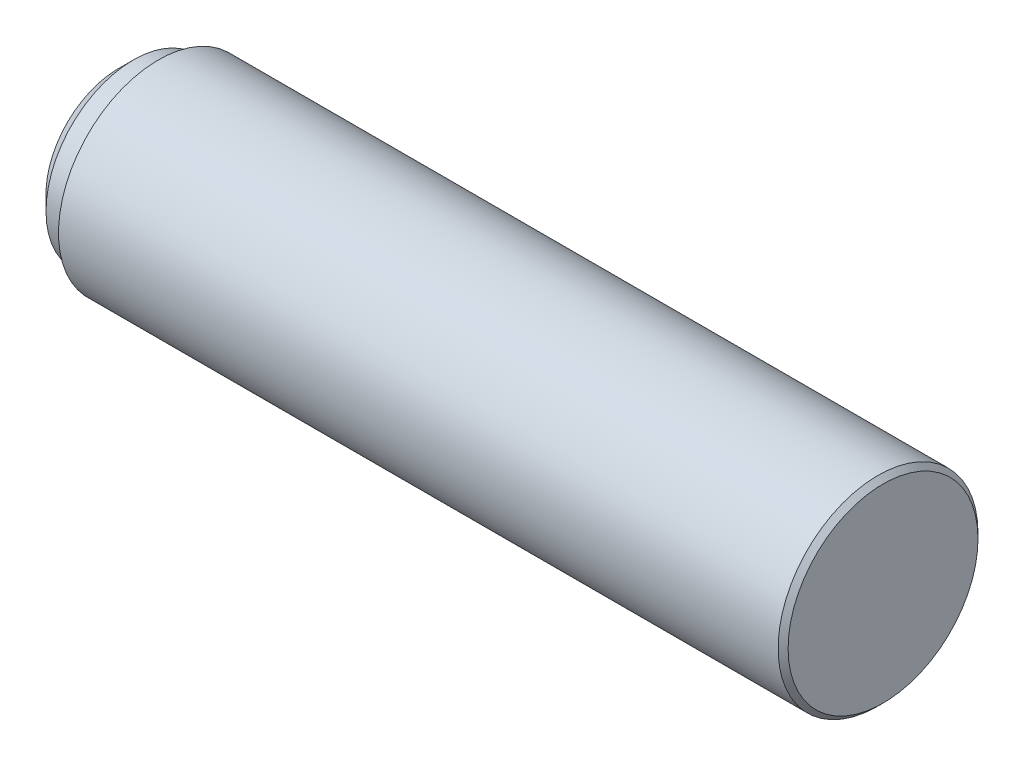
ISO-10303-21;
HEADER;
FILE_DESCRIPTION(('STEP AP214'),'2;1');
FILE_NAME('part.step','',(''),(''),'','','');
FILE_SCHEMA(('AUTOMOTIVE_DESIGN { 1 0 10303 214 1 1 1 1 }'));
ENDSEC;
DATA;
#1=APPLICATION_CONTEXT('core data for automotive mechanical design processes');
#2=APPLICATION_PROTOCOL_DEFINITION('international standard','automotive_design',2000,#1);
#3=PRODUCT_CONTEXT('',#1,'mechanical');
#4=PRODUCT('Part','Part','',(#3));
#5=PRODUCT_RELATED_PRODUCT_CATEGORY('part','',(#4));
#6=PRODUCT_DEFINITION_FORMATION('','',#4);
#7=PRODUCT_DEFINITION_CONTEXT('part definition',#1,'design');
#8=PRODUCT_DEFINITION('design','',#6,#7);
#9=PRODUCT_DEFINITION_SHAPE('','',#8);
#10=(LENGTH_UNIT() NAMED_UNIT(*) SI_UNIT(.MILLI.,.METRE.));
#11=(NAMED_UNIT(*) PLANE_ANGLE_UNIT() SI_UNIT($,.RADIAN.));
#12=(NAMED_UNIT(*) SI_UNIT($,.STERADIAN.) SOLID_ANGLE_UNIT());
#13=UNCERTAINTY_MEASURE_WITH_UNIT(LENGTH_MEASURE(1.E-05),#10,'distance_accuracy_value','');
#14=(GEOMETRIC_REPRESENTATION_CONTEXT(3) GLOBAL_UNCERTAINTY_ASSIGNED_CONTEXT((#13)) GLOBAL_UNIT_ASSIGNED_CONTEXT((#10,
#11,#12)) REPRESENTATION_CONTEXT('',''));
#15=CARTESIAN_POINT('',(0.,0.,0.));
#16=DIRECTION('',(0.,0.,1.));
#17=DIRECTION('',(1.,0.,0.));
#18=AXIS2_PLACEMENT_3D('',#15,#16,#17);
#19=CARTESIAN_POINT('',(145.,0.,0.));
#20=DIRECTION('',(-1.,0.,0.));
#21=DIRECTION('',(0.,0.,1.));
#22=AXIS2_PLACEMENT_3D('',#19,#20,#21);
#23=CYLINDRICAL_SURFACE('',#22,20.);
#24=CARTESIAN_POINT('',(144.,0.,0.));
#25=DIRECTION('',(1.,0.,0.));
#26=DIRECTION('',(0.,0.,-1.));
#27=AXIS2_PLACEMENT_3D('',#24,#25,#26);
#28=CIRCLE('',#27,20.);
#29=CARTESIAN_POINT('',(144.,0.,-20.));
#30=VERTEX_POINT('',#29);
#31=EDGE_CURVE('E10',#30,#30,#28,.F.);
#32=ORIENTED_EDGE('',*,*,#31,.T.);
#33=EDGE_LOOP('',(#32));
#34=FACE_BOUND('',#33,.T.);
#35=CARTESIAN_POINT('',(0.,0.,0.));
#36=DIRECTION('',(1.,0.,0.));
#37=DIRECTION('',(0.,0.,-1.));
#38=AXIS2_PLACEMENT_3D('',#35,#36,#37);
#39=CIRCLE('',#38,20.);
#40=CARTESIAN_POINT('',(0.,0.,-20.));
#41=VERTEX_POINT('',#40);
#42=EDGE_CURVE('E53',#41,#41,#39,.T.);
#43=ORIENTED_EDGE('',*,*,#42,.T.);
#44=EDGE_LOOP('',(#43));
#45=FACE_BOUND('',#44,.T.);
#46=ADVANCED_FACE('F32',(#34,#45),#23,.T.);
#47=CARTESIAN_POINT('',(145.,0.,0.));
#48=DIRECTION('',(1.,0.,0.));
#49=DIRECTION('',(0.,0.,-1.));
#50=AXIS2_PLACEMENT_3D('',#47,#48,#49);
#51=PLANE('',#50);
#52=CARTESIAN_POINT('',(145.,0.,0.));
#53=DIRECTION('',(1.,0.,0.));
#54=DIRECTION('',(0.,0.,-1.));
#55=AXIS2_PLACEMENT_3D('',#52,#53,#54);
#56=CIRCLE('',#55,19.);
#57=CARTESIAN_POINT('',(145.,0.,-19.));
#58=VERTEX_POINT('',#57);
#59=EDGE_CURVE('E39',#58,#58,#56,.T.);
#60=ORIENTED_EDGE('',*,*,#59,.T.);
#61=EDGE_LOOP('',(#60));
#62=FACE_BOUND('',#61,.T.);
#63=ADVANCED_FACE('F64',(#62),#51,.T.);
#64=CARTESIAN_POINT('',(0.,0.,0.));
#65=DIRECTION('',(1.,0.,0.));
#66=DIRECTION('',(0.,0.,-1.));
#67=AXIS2_PLACEMENT_3D('',#64,#65,#66);
#68=PLANE('',#67);
#69=CARTESIAN_POINT('',(0.,0.,0.));
#70=DIRECTION('',(-1.,0.,0.));
#71=DIRECTION('',(0.,0.,1.));
#72=AXIS2_PLACEMENT_3D('',#69,#70,#71);
#73=CIRCLE('',#72,17.5);
#74=CARTESIAN_POINT('',(0.,0.,17.5));
#75=VERTEX_POINT('',#74);
#76=EDGE_CURVE('E52',#75,#75,#73,.T.);
#77=ORIENTED_EDGE('',*,*,#76,.F.);
#78=EDGE_LOOP('',(#77));
#79=FACE_BOUND('',#78,.T.);
#80=ORIENTED_EDGE('',*,*,#42,.F.);
#81=EDGE_LOOP('',(#80));
#82=FACE_BOUND('',#81,.T.);
#83=ADVANCED_FACE('F61',(#79,#82),#68,.F.);
#84=CARTESIAN_POINT('',(-8.,0.,0.));
#85=DIRECTION('',(1.,0.,0.));
#86=DIRECTION('',(0.,0.,-1.));
#87=AXIS2_PLACEMENT_3D('',#84,#85,#86);
#88=CYLINDRICAL_SURFACE('',#87,17.5);
#89=CARTESIAN_POINT('',(-4.99999999999998,0.,0.));
#90=DIRECTION('',(-1.,0.,0.));
#91=DIRECTION('',(0.,0.,1.));
#92=AXIS2_PLACEMENT_3D('',#89,#90,#91);
#93=CIRCLE('',#92,17.5);
#94=CARTESIAN_POINT('',(-4.99999999999998,0.,-17.5));
#95=VERTEX_POINT('',#94);
#96=EDGE_CURVE('E43',#95,#95,#93,.F.);
#97=ORIENTED_EDGE('',*,*,#96,.T.);
#98=EDGE_LOOP('',(#97));
#99=FACE_BOUND('',#98,.T.);
#100=ORIENTED_EDGE('',*,*,#76,.T.);
#101=EDGE_LOOP('',(#100));
#102=FACE_BOUND('',#101,.T.);
#103=ADVANCED_FACE('F59',(#99,#102),#88,.T.);
#104=CARTESIAN_POINT('',(-8.,0.,0.));
#105=DIRECTION('',(-1.,0.,0.));
#106=DIRECTION('',(0.,0.,1.));
#107=AXIS2_PLACEMENT_3D('',#104,#105,#106);
#108=PLANE('',#107);
#109=CARTESIAN_POINT('',(-8.,0.,0.));
#110=DIRECTION('',(-1.,0.,0.));
#111=DIRECTION('',(0.,0.,1.));
#112=AXIS2_PLACEMENT_3D('',#109,#110,#111);
#113=CIRCLE('',#112,14.5);
#114=CARTESIAN_POINT('',(-8.,0.,-14.5));
#115=VERTEX_POINT('',#114);
#116=EDGE_CURVE('E47',#115,#115,#113,.T.);
#117=ORIENTED_EDGE('',*,*,#116,.T.);
#118=EDGE_LOOP('',(#117));
#119=FACE_BOUND('',#118,.T.);
#120=ADVANCED_FACE('F76',(#119),#108,.T.);
#121=CARTESIAN_POINT('',(-8.,0.,0.));
#122=DIRECTION('',(1.,0.,0.));
#123=DIRECTION('',(0.,0.,-1.));
#124=AXIS2_PLACEMENT_3D('',#121,#122,#123);
#125=CONICAL_SURFACE('',#124,14.5,0.78539816339745);
#126=CARTESIAN_POINT('',(-4.99999999999998,0.,-17.5));
#127=CARTESIAN_POINT('',(-5.03124999999998,0.,-17.46875));
#128=CARTESIAN_POINT('',(-5.06249999999998,0.,-17.4375));
#129=CARTESIAN_POINT('',(-5.12499999999998,0.,-17.375));
#130=CARTESIAN_POINT('',(-5.15624999999998,0.,-17.34375));
#131=CARTESIAN_POINT('',(-5.21874999999998,0.,-17.28125));
#132=CARTESIAN_POINT('',(-5.24999999999998,0.,-17.25));
#133=CARTESIAN_POINT('',(-5.31249999999998,0.,-17.1875));
#134=CARTESIAN_POINT('',(-5.34374999999998,0.,-17.15625));
#135=CARTESIAN_POINT('',(-5.40624999999998,0.,-17.09375));
#136=CARTESIAN_POINT('',(-5.43749999999998,0.,-17.0625));
#137=CARTESIAN_POINT('',(-5.49999999999998,0.,-17.));
#138=CARTESIAN_POINT('',(-5.53124999999998,0.,-16.96875));
#139=CARTESIAN_POINT('',(-5.59374999999998,0.,-16.90625));
#140=CARTESIAN_POINT('',(-5.62499999999998,0.,-16.875));
#141=CARTESIAN_POINT('',(-5.68749999999998,0.,-16.8125));
#142=CARTESIAN_POINT('',(-5.71874999999998,0.,-16.78125));
#143=CARTESIAN_POINT('',(-5.78124999999998,0.,-16.71875));
#144=CARTESIAN_POINT('',(-5.81249999999998,0.,-16.6875));
#145=CARTESIAN_POINT('',(-5.87499999999998,0.,-16.625));
#146=CARTESIAN_POINT('',(-5.90624999999998,0.,-16.59375));
#147=CARTESIAN_POINT('',(-5.96874999999998,0.,-16.53125));
#148=CARTESIAN_POINT('',(-5.99999999999998,0.,-16.5));
#149=CARTESIAN_POINT('',(-6.06249999999998,0.,-16.4375));
#150=CARTESIAN_POINT('',(-6.09374999999998,0.,-16.40625));
#151=CARTESIAN_POINT('',(-6.15624999999998,0.,-16.34375));
#152=CARTESIAN_POINT('',(-6.18749999999999,0.,-16.3125));
#153=CARTESIAN_POINT('',(-6.24999999999999,0.,-16.25));
#154=CARTESIAN_POINT('',(-6.28124999999999,0.,-16.21875));
#155=CARTESIAN_POINT('',(-6.34374999999999,0.,-16.15625));
#156=CARTESIAN_POINT('',(-6.37499999999999,0.,-16.125));
#157=CARTESIAN_POINT('',(-6.43749999999999,0.,-16.0625));
#158=CARTESIAN_POINT('',(-6.46874999999999,0.,-16.03125));
#159=CARTESIAN_POINT('',(-6.53124999999999,0.,-15.96875));
#160=CARTESIAN_POINT('',(-6.56249999999999,0.,-15.9375));
#161=CARTESIAN_POINT('',(-6.62499999999999,0.,-15.875));
#162=CARTESIAN_POINT('',(-6.65624999999999,0.,-15.84375));
#163=CARTESIAN_POINT('',(-6.71874999999999,0.,-15.78125));
#164=CARTESIAN_POINT('',(-6.74999999999999,0.,-15.75));
#165=CARTESIAN_POINT('',(-6.81249999999999,0.,-15.6875));
#166=CARTESIAN_POINT('',(-6.84374999999999,0.,-15.65625));
#167=CARTESIAN_POINT('',(-6.90624999999999,0.,-15.59375));
#168=CARTESIAN_POINT('',(-6.93749999999999,0.,-15.5625));
#169=CARTESIAN_POINT('',(-6.99999999999999,0.,-15.5));
#170=CARTESIAN_POINT('',(-7.03124999999999,0.,-15.46875));
#171=CARTESIAN_POINT('',(-7.09374999999999,0.,-15.40625));
#172=CARTESIAN_POINT('',(-7.12499999999999,0.,-15.375));
#173=CARTESIAN_POINT('',(-7.18749999999999,0.,-15.3125));
#174=CARTESIAN_POINT('',(-7.21874999999999,0.,-15.28125));
#175=CARTESIAN_POINT('',(-7.28124999999999,0.,-15.21875));
#176=CARTESIAN_POINT('',(-7.31249999999999,0.,-15.1875));
#177=CARTESIAN_POINT('',(-7.37499999999999,0.,-15.125));
#178=CARTESIAN_POINT('',(-7.40625,0.,-15.09375));
#179=CARTESIAN_POINT('',(-7.46875,0.,-15.03125));
#180=CARTESIAN_POINT('',(-7.5,0.,-15.));
#181=CARTESIAN_POINT('',(-7.5625,0.,-14.9375));
#182=CARTESIAN_POINT('',(-7.59375,0.,-14.90625));
#183=CARTESIAN_POINT('',(-7.65625,0.,-14.84375));
#184=CARTESIAN_POINT('',(-7.6875,0.,-14.8125));
#185=CARTESIAN_POINT('',(-7.75,0.,-14.75));
#186=CARTESIAN_POINT('',(-7.78125,0.,-14.71875));
#187=CARTESIAN_POINT('',(-7.84375,0.,-14.65625));
#188=CARTESIAN_POINT('',(-7.875,0.,-14.625));
#189=CARTESIAN_POINT('',(-7.9375,0.,-14.5625));
#190=CARTESIAN_POINT('',(-7.96875,0.,-14.53125));
#191=CARTESIAN_POINT('',(-8.,0.,-14.5));
#192=B_SPLINE_CURVE_WITH_KNOTS('',3,(#126,#127,#128,#129,#130,#131,#132,#133,#134,#135,#136,
#137,#138,#139,#140,#141,#142,#143,#144,#145,#146,#147,#148,#149,#150,#151,#152,#153,#154,#155,
#156,#157,#158,#159,#160,#161,#162,#163,#164,#165,#166,#167,#168,#169,#170,#171,#172,#173,#174,
#175,#176,#177,#178,#179,#180,#181,#182,#183,#184,#185,#186,#187,#188,#189,#190,#191),
.UNSPECIFIED.,.F.,.F.,(4,2,2,2,2,2,2,2,2,2,2,2,2,2,2,2,2,2,2,2,2,2,2,2,2,2,2,2,2,2,2,2,4),(0.,
0.132582521472478,0.265165042944956,0.397747564417435,0.530330085889915,0.662912607362394,
0.795495128834872,0.928077650307352,1.06066017177983,1.19324269325231,1.32582521472479,
1.45840773619727,1.59099025766975,1.72357277914222,1.85615530061471,1.98873782208718,
2.12132034355966,2.25390286503214,2.38648538650462,2.5190679079771,2.65165042944958,
2.78423295092206,2.91681547239454,3.04939799386701,3.18198051533949,3.31456303681197,
3.44714555828445,3.57972807975693,3.71231060122941,3.84489312270189,3.97747564417437,
4.11005816564685,4.24264068711933),.UNSPECIFIED.);
#193=EDGE_CURVE('BSEAM74',#95,#115,#192,.T.);
#194=ORIENTED_EDGE('',*,*,#96,.F.);
#195=ORIENTED_EDGE('',*,*,#116,.F.);
#196=ORIENTED_EDGE('',*,*,#193,.T.);
#197=ORIENTED_EDGE('',*,*,#193,.F.);
#198=EDGE_LOOP('',(#194,#196,#195,#197));
#199=FACE_BOUND('',#198,.T.);
#200=ADVANCED_FACE('F74',(#199),#125,.T.);
#201=CARTESIAN_POINT('',(145.,0.,0.));
#202=DIRECTION('',(-1.,0.,0.));
#203=DIRECTION('',(0.,0.,1.));
#204=AXIS2_PLACEMENT_3D('',#201,#202,#203);
#205=CONICAL_SURFACE('',#204,19.,0.78539816339744);
#206=ORIENTED_EDGE('',*,*,#31,.F.);
#207=EDGE_LOOP('',(#206));
#208=FACE_BOUND('',#207,.T.);
#209=ORIENTED_EDGE('',*,*,#59,.F.);
#210=EDGE_LOOP('',(#209));
#211=FACE_BOUND('',#210,.T.);
#212=ADVANCED_FACE('F34',(#208,#211),#205,.T.);
#213=CLOSED_SHELL('',(#46,#63,#83,#103,#120,#200,#212));
#214=MANIFOLD_SOLID_BREP('B2',#213);
#215=ADVANCED_BREP_SHAPE_REPRESENTATION('',(#18,#214),#14);
#216=SHAPE_DEFINITION_REPRESENTATION(#9,#215);
ENDSEC;
END-ISO-10303-21;
